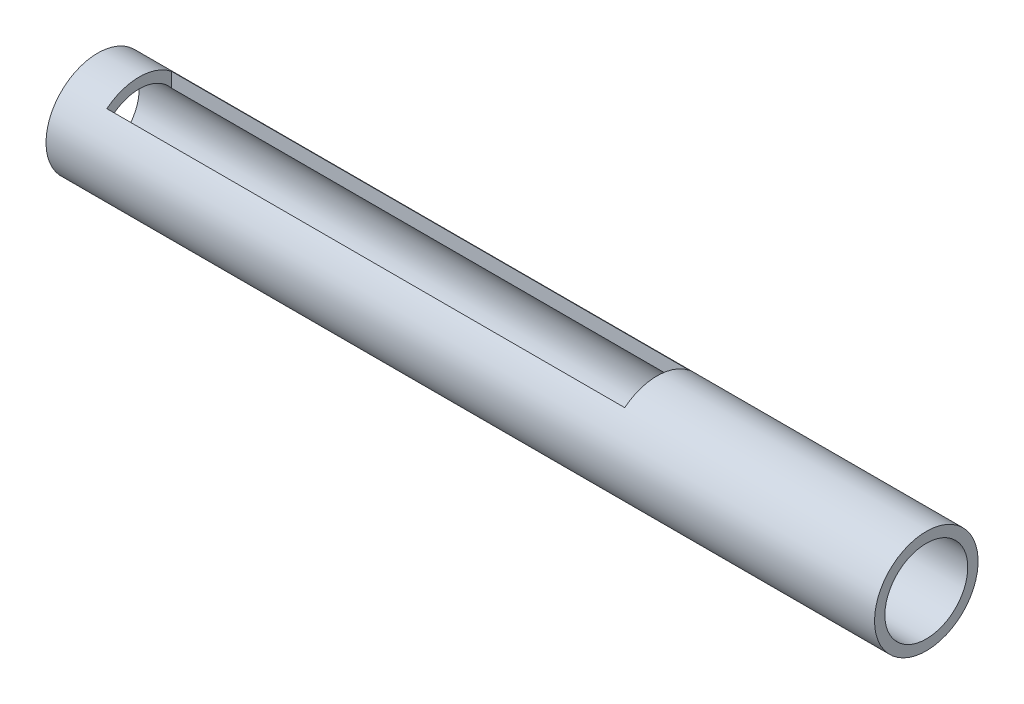
ISO-10303-21;
HEADER;
FILE_DESCRIPTION(('STEP AP214'),'2;1');
FILE_NAME('part.step','',(''),(''),'','','');
FILE_SCHEMA(('AUTOMOTIVE_DESIGN { 1 0 10303 214 1 1 1 1 }'));
ENDSEC;
DATA;
#1=APPLICATION_CONTEXT('core data for automotive mechanical design processes');
#2=APPLICATION_PROTOCOL_DEFINITION('international standard','automotive_design',2000,#1);
#3=PRODUCT_CONTEXT('',#1,'mechanical');
#4=PRODUCT('Part','Part','',(#3));
#5=PRODUCT_RELATED_PRODUCT_CATEGORY('part','',(#4));
#6=PRODUCT_DEFINITION_FORMATION('','',#4);
#7=PRODUCT_DEFINITION_CONTEXT('part definition',#1,'design');
#8=PRODUCT_DEFINITION('design','',#6,#7);
#9=PRODUCT_DEFINITION_SHAPE('','',#8);
#10=(LENGTH_UNIT() NAMED_UNIT(*) SI_UNIT(.MILLI.,.METRE.));
#11=(NAMED_UNIT(*) PLANE_ANGLE_UNIT() SI_UNIT($,.RADIAN.));
#12=(NAMED_UNIT(*) SI_UNIT($,.STERADIAN.) SOLID_ANGLE_UNIT());
#13=UNCERTAINTY_MEASURE_WITH_UNIT(LENGTH_MEASURE(1.E-05),#10,'distance_accuracy_value','');
#14=(GEOMETRIC_REPRESENTATION_CONTEXT(3) GLOBAL_UNCERTAINTY_ASSIGNED_CONTEXT((#13)) GLOBAL_UNIT_ASSIGNED_CONTEXT((#10,
#11,#12)) REPRESENTATION_CONTEXT('',''));
#15=CARTESIAN_POINT('',(0.,0.,0.));
#16=DIRECTION('',(0.,0.,1.));
#17=DIRECTION('',(1.,0.,0.));
#18=AXIS2_PLACEMENT_3D('',#15,#16,#17);
#19=CARTESIAN_POINT('',(-172.073578595318,12.7090301003344,0.));
#20=DIRECTION('',(-1.,0.,0.));
#21=DIRECTION('',(0.,0.,1.));
#22=AXIS2_PLACEMENT_3D('',#19,#20,#21);
#23=CYLINDRICAL_SURFACE('',#22,25.);
#24=CARTESIAN_POINT('',(97.9264214046823,12.7090301003344,0.));
#25=DIRECTION('',(1.,0.,0.));
#26=DIRECTION('',(0.,0.,-1.));
#27=AXIS2_PLACEMENT_3D('',#24,#25,#26);
#28=CIRCLE('',#27,25.);
#29=CARTESIAN_POINT('',(97.9264214046823,32.2298439970196,-15.6185090457118));
#30=VERTEX_POINT('',#29);
#31=CARTESIAN_POINT('',(97.9264214046823,32.2298439970196,15.6185090457118));
#32=VERTEX_POINT('',#31);
#33=EDGE_CURVE('E118',#30,#32,#28,.T.);
#34=ORIENTED_EDGE('',*,*,#33,.T.);
#35=DIRECTION('',(-1.,0.,0.));
#36=VECTOR('',#35,1.);
#37=CARTESIAN_POINT('',(-172.073578595318,32.2298439970196,15.6185090457118));
#38=LINE('',#37,#36);
#39=CARTESIAN_POINT('',(-152.073578595318,32.2298439970196,15.6185090457118));
#40=VERTEX_POINT('',#39);
#41=EDGE_CURVE('E89',#32,#40,#38,.T.);
#42=ORIENTED_EDGE('',*,*,#41,.T.);
#43=CARTESIAN_POINT('',(-152.073578595318,12.7090301003344,0.));
#44=DIRECTION('',(-1.,0.,0.));
#45=DIRECTION('',(0.,0.,1.));
#46=AXIS2_PLACEMENT_3D('',#43,#44,#45);
#47=CIRCLE('',#46,25.);
#48=CARTESIAN_POINT('',(-152.073578595318,32.2298439970196,-15.6185090457118));
#49=VERTEX_POINT('',#48);
#50=EDGE_CURVE('E112',#40,#49,#47,.T.);
#51=ORIENTED_EDGE('',*,*,#50,.T.);
#52=DIRECTION('',(-1.,0.,0.));
#53=VECTOR('',#52,1.);
#54=CARTESIAN_POINT('',(-172.073578595318,32.2298439970196,-15.6185090457118));
#55=LINE('',#54,#53);
#56=EDGE_CURVE('E115',#49,#30,#55,.F.);
#57=ORIENTED_EDGE('',*,*,#56,.T.);
#58=EDGE_LOOP('',(#34,#42,#51,#57));
#59=FACE_BOUND('',#58,.T.);
#60=CARTESIAN_POINT('',(-172.073578595318,12.7090301003344,0.));
#61=DIRECTION('',(-1.,0.,0.));
#62=DIRECTION('',(0.,0.,1.));
#63=AXIS2_PLACEMENT_3D('',#60,#61,#62);
#64=CIRCLE('',#63,25.);
#65=CARTESIAN_POINT('',(-172.073578595318,12.7090301003344,25.));
#66=VERTEX_POINT('',#65);
#67=EDGE_CURVE('E82',#66,#66,#64,.T.);
#68=ORIENTED_EDGE('',*,*,#67,.F.);
#69=EDGE_LOOP('',(#68));
#70=FACE_BOUND('',#69,.T.);
#71=CARTESIAN_POINT('',(227.926421404682,12.7090301003344,0.));
#72=DIRECTION('',(-1.,0.,0.));
#73=DIRECTION('',(0.,0.,1.));
#74=AXIS2_PLACEMENT_3D('',#71,#72,#73);
#75=CIRCLE('',#74,25.);
#76=CARTESIAN_POINT('',(227.926421404682,12.7090301003344,25.));
#77=VERTEX_POINT('',#76);
#78=EDGE_CURVE('E102',#77,#77,#75,.T.);
#79=ORIENTED_EDGE('',*,*,#78,.T.);
#80=EDGE_LOOP('',(#79));
#81=FACE_BOUND('',#80,.T.);
#82=ADVANCED_FACE('F40',(#59,#70,#81),#23,.T.);
#83=CARTESIAN_POINT('',(-172.073578595318,37.7090301003344,0.));
#84=DIRECTION('',(1.,0.,0.));
#85=DIRECTION('',(0.,0.,-1.));
#86=AXIS2_PLACEMENT_3D('',#83,#84,#85);
#87=PLANE('',#86);
#88=CARTESIAN_POINT('',(-172.073578595318,12.7090301003344,0.));
#89=DIRECTION('',(-1.,0.,0.));
#90=DIRECTION('',(0.,0.,1.));
#91=AXIS2_PLACEMENT_3D('',#88,#89,#90);
#92=CIRCLE('',#91,20.);
#93=CARTESIAN_POINT('',(-172.073578595318,12.7090301003344,20.));
#94=VERTEX_POINT('',#93);
#95=EDGE_CURVE('E106',#94,#94,#92,.T.);
#96=ORIENTED_EDGE('',*,*,#95,.F.);
#97=EDGE_LOOP('',(#96));
#98=FACE_BOUND('',#97,.T.);
#99=ORIENTED_EDGE('',*,*,#67,.T.);
#100=EDGE_LOOP('',(#99));
#101=FACE_BOUND('',#100,.T.);
#102=ADVANCED_FACE('F138',(#98,#101),#87,.F.);
#103=CARTESIAN_POINT('',(227.926421404682,12.7090301003344,0.));
#104=DIRECTION('',(-1.,0.,0.));
#105=DIRECTION('',(0.,0.,1.));
#106=AXIS2_PLACEMENT_3D('',#103,#104,#105);
#107=PLANE('',#106);
#108=CARTESIAN_POINT('',(227.926421404682,12.7090301003345,0.));
#109=DIRECTION('',(-1.,0.,0.));
#110=DIRECTION('',(0.,0.,1.));
#111=AXIS2_PLACEMENT_3D('',#108,#109,#110);
#112=CIRCLE('',#111,20.);
#113=CARTESIAN_POINT('',(227.926421404682,12.7090301003345,20.));
#114=VERTEX_POINT('',#113);
#115=EDGE_CURVE('E105',#114,#114,#112,.T.);
#116=ORIENTED_EDGE('',*,*,#115,.T.);
#117=EDGE_LOOP('',(#116));
#118=FACE_BOUND('',#117,.T.);
#119=ORIENTED_EDGE('',*,*,#78,.F.);
#120=EDGE_LOOP('',(#119));
#121=FACE_BOUND('',#120,.T.);
#122=ADVANCED_FACE('F144',(#118,#121),#107,.F.);
#123=CARTESIAN_POINT('',(227.926421404682,12.7090301003345,0.));
#124=DIRECTION('',(-1.,0.,0.));
#125=DIRECTION('',(0.,-1.,0.));
#126=AXIS2_PLACEMENT_3D('',#123,#124,#125);
#127=CYLINDRICAL_SURFACE('',#126,20.);
#128=CARTESIAN_POINT('',(-152.073578595318,12.7090301003344,0.));
#129=DIRECTION('',(-1.,0.,0.));
#130=DIRECTION('',(0.,0.,1.));
#131=AXIS2_PLACEMENT_3D('',#128,#129,#130);
#132=CIRCLE('',#131,20.);
#133=CARTESIAN_POINT('',(-152.073578595318,25.2015148487349,-15.6185090457118));
#134=VERTEX_POINT('',#133);
#135=CARTESIAN_POINT('',(-152.073578595318,25.2015148487349,15.6185090457118));
#136=VERTEX_POINT('',#135);
#137=EDGE_CURVE('E47',#134,#136,#132,.F.);
#138=ORIENTED_EDGE('',*,*,#137,.T.);
#139=DIRECTION('',(-1.,0.,0.));
#140=VECTOR('',#139,1.);
#141=CARTESIAN_POINT('',(227.926421404682,25.201514848735,15.6185090457118));
#142=LINE('',#141,#140);
#143=CARTESIAN_POINT('',(97.9264214046822,25.201514848735,15.6185090457118));
#144=VERTEX_POINT('',#143);
#145=EDGE_CURVE('E11',#136,#144,#142,.F.);
#146=ORIENTED_EDGE('',*,*,#145,.T.);
#147=CARTESIAN_POINT('',(97.9264214046822,12.7090301003345,0.));
#148=DIRECTION('',(1.,0.,0.));
#149=DIRECTION('',(0.,0.,-1.));
#150=AXIS2_PLACEMENT_3D('',#147,#148,#149);
#151=CIRCLE('',#150,20.);
#152=CARTESIAN_POINT('',(97.9264214046822,25.2015148487349,-15.6185090457118));
#153=VERTEX_POINT('',#152);
#154=EDGE_CURVE('E77',#144,#153,#151,.F.);
#155=ORIENTED_EDGE('',*,*,#154,.T.);
#156=DIRECTION('',(-1.,0.,0.));
#157=VECTOR('',#156,1.);
#158=CARTESIAN_POINT('',(227.926421404682,25.201514848735,-15.6185090457118));
#159=LINE('',#158,#157);
#160=EDGE_CURVE('E81',#153,#134,#159,.T.);
#161=ORIENTED_EDGE('',*,*,#160,.T.);
#162=EDGE_LOOP('',(#138,#146,#155,#161));
#163=FACE_BOUND('',#162,.T.);
#164=ORIENTED_EDGE('',*,*,#115,.F.);
#165=EDGE_LOOP('',(#164));
#166=FACE_BOUND('',#165,.T.);
#167=ORIENTED_EDGE('',*,*,#95,.T.);
#168=EDGE_LOOP('',(#167));
#169=FACE_BOUND('',#168,.T.);
#170=ADVANCED_FACE('F93',(#163,#166,#169),#127,.F.);
#171=CARTESIAN_POINT('',(-152.073578595318,22.,15.6185090457118));
#172=DIRECTION('',(0.,0.,1.));
#173=DIRECTION('',(1.,0.,0.));
#174=AXIS2_PLACEMENT_3D('',#171,#172,#173);
#175=PLANE('',#174);
#176=DIRECTION('',(0.,1.,0.));
#177=VECTOR('',#176,1.);
#178=CARTESIAN_POINT('',(97.9264214046822,22.,15.6185090457118));
#179=LINE('',#178,#177);
#180=EDGE_CURVE('E54',#144,#32,#179,.T.);
#181=ORIENTED_EDGE('',*,*,#180,.F.);
#182=ORIENTED_EDGE('',*,*,#145,.F.);
#183=DIRECTION('',(0.,1.,0.));
#184=VECTOR('',#183,1.);
#185=CARTESIAN_POINT('',(-152.073578595318,22.,15.6185090457118));
#186=LINE('',#185,#184);
#187=EDGE_CURVE('E119',#136,#40,#186,.T.);
#188=ORIENTED_EDGE('',*,*,#187,.T.);
#189=ORIENTED_EDGE('',*,*,#41,.F.);
#190=EDGE_LOOP('',(#181,#182,#188,#189));
#191=FACE_BOUND('',#190,.T.);
#192=ADVANCED_FACE('F85',(#191),#175,.F.);
#193=CARTESIAN_POINT('',(-152.073578595318,22.,-15.6185090457118));
#194=DIRECTION('',(-1.,0.,0.));
#195=DIRECTION('',(0.,0.,1.));
#196=AXIS2_PLACEMENT_3D('',#193,#194,#195);
#197=PLANE('',#196);
#198=ORIENTED_EDGE('',*,*,#187,.F.);
#199=ORIENTED_EDGE('',*,*,#137,.F.);
#200=DIRECTION('',(0.,1.,0.));
#201=VECTOR('',#200,1.);
#202=CARTESIAN_POINT('',(-152.073578595318,22.,-15.6185090457118));
#203=LINE('',#202,#201);
#204=EDGE_CURVE('E122',#134,#49,#203,.T.);
#205=ORIENTED_EDGE('',*,*,#204,.T.);
#206=ORIENTED_EDGE('',*,*,#50,.F.);
#207=EDGE_LOOP('',(#198,#199,#205,#206));
#208=FACE_BOUND('',#207,.T.);
#209=ADVANCED_FACE('F128',(#208),#197,.F.);
#210=CARTESIAN_POINT('',(97.9264214046822,22.,-15.6185090457118));
#211=DIRECTION('',(0.,0.,-1.));
#212=DIRECTION('',(-1.,0.,0.));
#213=AXIS2_PLACEMENT_3D('',#210,#211,#212);
#214=PLANE('',#213);
#215=ORIENTED_EDGE('',*,*,#204,.F.);
#216=ORIENTED_EDGE('',*,*,#160,.F.);
#217=DIRECTION('',(0.,1.,0.));
#218=VECTOR('',#217,1.);
#219=CARTESIAN_POINT('',(97.9264214046822,22.,-15.6185090457118));
#220=LINE('',#219,#218);
#221=EDGE_CURVE('E59',#153,#30,#220,.T.);
#222=ORIENTED_EDGE('',*,*,#221,.T.);
#223=ORIENTED_EDGE('',*,*,#56,.F.);
#224=EDGE_LOOP('',(#215,#216,#222,#223));
#225=FACE_BOUND('',#224,.T.);
#226=ADVANCED_FACE('F127',(#225),#214,.F.);
#227=CARTESIAN_POINT('',(97.9264214046822,22.,15.6185090457118));
#228=DIRECTION('',(1.,0.,0.));
#229=DIRECTION('',(0.,0.,-1.));
#230=AXIS2_PLACEMENT_3D('',#227,#228,#229);
#231=PLANE('',#230);
#232=ORIENTED_EDGE('',*,*,#221,.F.);
#233=ORIENTED_EDGE('',*,*,#154,.F.);
#234=ORIENTED_EDGE('',*,*,#180,.T.);
#235=ORIENTED_EDGE('',*,*,#33,.F.);
#236=EDGE_LOOP('',(#232,#233,#234,#235));
#237=FACE_BOUND('',#236,.T.);
#238=ADVANCED_FACE('F78',(#237),#231,.F.);
#239=CLOSED_SHELL('',(#82,#102,#122,#170,#192,#209,#226,#238));
#240=MANIFOLD_SOLID_BREP('B2',#239);
#241=ADVANCED_BREP_SHAPE_REPRESENTATION('',(#18,#240),#14);
#242=SHAPE_DEFINITION_REPRESENTATION(#9,#241);
ENDSEC;
END-ISO-10303-21;
